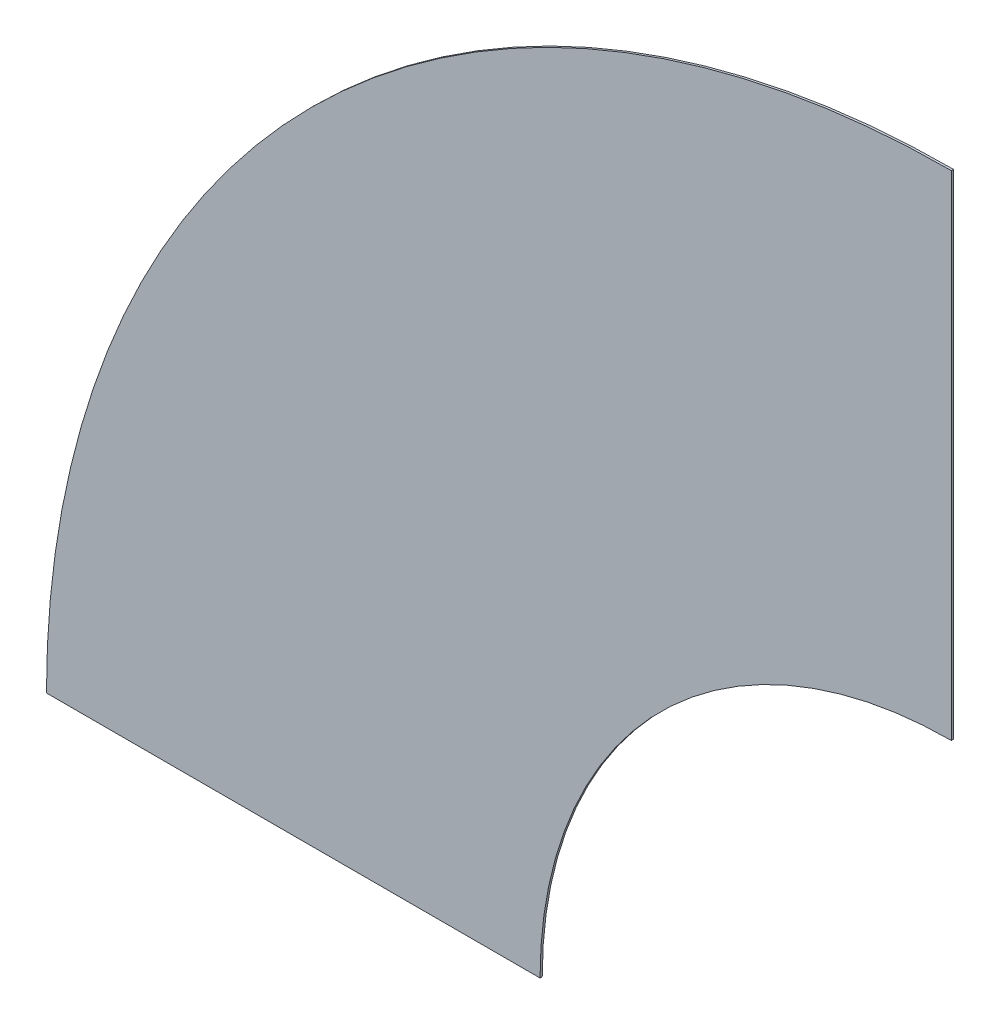
ISO-10303-21;
HEADER;
FILE_DESCRIPTION(('STEP AP214'),'2;1');
FILE_NAME('part.step','',(''),(''),'','','');
FILE_SCHEMA(('AUTOMOTIVE_DESIGN { 1 0 10303 214 1 1 1 1 }'));
ENDSEC;
DATA;
#1=APPLICATION_CONTEXT('core data for automotive mechanical design processes');
#2=APPLICATION_PROTOCOL_DEFINITION('international standard','automotive_design',2000,#1);
#3=PRODUCT_CONTEXT('',#1,'mechanical');
#4=PRODUCT('Part','Part','',(#3));
#5=PRODUCT_RELATED_PRODUCT_CATEGORY('part','',(#4));
#6=PRODUCT_DEFINITION_FORMATION('','',#4);
#7=PRODUCT_DEFINITION_CONTEXT('part definition',#1,'design');
#8=PRODUCT_DEFINITION('design','',#6,#7);
#9=PRODUCT_DEFINITION_SHAPE('','',#8);
#10=(LENGTH_UNIT() NAMED_UNIT(*) SI_UNIT(.MILLI.,.METRE.));
#11=(NAMED_UNIT(*) PLANE_ANGLE_UNIT() SI_UNIT($,.RADIAN.));
#12=(NAMED_UNIT(*) SI_UNIT($,.STERADIAN.) SOLID_ANGLE_UNIT());
#13=UNCERTAINTY_MEASURE_WITH_UNIT(LENGTH_MEASURE(1.E-05),#10,'distance_accuracy_value','');
#14=(GEOMETRIC_REPRESENTATION_CONTEXT(3) GLOBAL_UNCERTAINTY_ASSIGNED_CONTEXT((#13)) GLOBAL_UNIT_ASSIGNED_CONTEXT((#10,
#11,#12)) REPRESENTATION_CONTEXT('',''));
#15=CARTESIAN_POINT('',(0.,0.,0.));
#16=DIRECTION('',(0.,0.,1.));
#17=DIRECTION('',(1.,0.,0.));
#18=AXIS2_PLACEMENT_3D('',#15,#16,#17);
#19=CARTESIAN_POINT('',(0.,0.,0.));
#20=DIRECTION('',(-1.,0.,0.));
#21=DIRECTION('',(0.,-1.,0.));
#22=AXIS2_PLACEMENT_3D('',#19,#20,#21);
#23=PLANE('',#22);
#24=DIRECTION('',(0.,1.,0.));
#25=VECTOR('',#24,1.);
#26=CARTESIAN_POINT('',(0.,825.,0.999999999999931));
#27=LINE('',#26,#25);
#28=CARTESIAN_POINT('',(0.,375.,1.00000000000007));
#29=VERTEX_POINT('',#28);
#30=CARTESIAN_POINT('',(0.,825.,0.999999999999931));
#31=VERTEX_POINT('',#30);
#32=EDGE_CURVE('E76',#29,#31,#27,.T.);
#33=ORIENTED_EDGE('',*,*,#32,.F.);
#34=DIRECTION('',(0.,0.,1.));
#35=VECTOR('',#34,1.);
#36=CARTESIAN_POINT('',(0.,375.,-0.999999999999931));
#37=LINE('',#36,#35);
#38=CARTESIAN_POINT('',(0.,375.,-0.999999999999931));
#39=VERTEX_POINT('',#38);
#40=EDGE_CURVE('E80',#39,#29,#37,.T.);
#41=ORIENTED_EDGE('',*,*,#40,.F.);
#42=DIRECTION('',(0.,-1.,0.));
#43=VECTOR('',#42,1.);
#44=CARTESIAN_POINT('',(0.,825.,-1.00000000000007));
#45=LINE('',#44,#43);
#46=CARTESIAN_POINT('',(0.,825.,-1.00000000000007));
#47=VERTEX_POINT('',#46);
#48=EDGE_CURVE('E83',#47,#39,#45,.T.);
#49=ORIENTED_EDGE('',*,*,#48,.F.);
#50=DIRECTION('',(0.,0.,-1.));
#51=VECTOR('',#50,1.);
#52=CARTESIAN_POINT('',(0.,825.,-1.00000000000007));
#53=LINE('',#52,#51);
#54=EDGE_CURVE('E71',#31,#47,#53,.T.);
#55=ORIENTED_EDGE('',*,*,#54,.F.);
#56=EDGE_LOOP('',(#33,#41,#49,#55));
#57=FACE_BOUND('',#56,.T.);
#58=ADVANCED_FACE('F41',(#57),#23,.F.);
#59=CARTESIAN_POINT('',(0.,0.,0.));
#60=DIRECTION('',(0.,-1.,0.));
#61=DIRECTION('',(1.,0.,0.));
#62=AXIS2_PLACEMENT_3D('',#59,#60,#61);
#63=PLANE('',#62);
#64=DIRECTION('',(-1.,0.,0.));
#65=VECTOR('',#64,1.);
#66=CARTESIAN_POINT('',(-825.,-2.50032122992888E-12,0.999999999999931));
#67=LINE('',#66,#65);
#68=CARTESIAN_POINT('',(-375.,-1.15654932486281E-12,1.00000000000007));
#69=VERTEX_POINT('',#68);
#70=CARTESIAN_POINT('',(-825.,-2.50032122992888E-12,0.999999999999931));
#71=VERTEX_POINT('',#70);
#72=EDGE_CURVE('E54',#69,#71,#67,.T.);
#73=ORIENTED_EDGE('',*,*,#72,.T.);
#74=DIRECTION('',(0.,0.,-1.));
#75=VECTOR('',#74,1.);
#76=CARTESIAN_POINT('',(-825.,-2.50032122992888E-12,-1.00000000000007));
#77=LINE('',#76,#75);
#78=CARTESIAN_POINT('',(-825.,-2.50032122992888E-12,-1.00000000000007));
#79=VERTEX_POINT('',#78);
#80=EDGE_CURVE('E11',#71,#79,#77,.T.);
#81=ORIENTED_EDGE('',*,*,#80,.T.);
#82=DIRECTION('',(1.,0.,0.));
#83=VECTOR('',#82,1.);
#84=CARTESIAN_POINT('',(-825.,-2.50032122992888E-12,-1.00000000000007));
#85=LINE('',#84,#83);
#86=CARTESIAN_POINT('',(-375.,-1.15654932486281E-12,-0.999999999999931));
#87=VERTEX_POINT('',#86);
#88=EDGE_CURVE('E97',#79,#87,#85,.T.);
#89=ORIENTED_EDGE('',*,*,#88,.T.);
#90=DIRECTION('',(0.,0.,1.));
#91=VECTOR('',#90,1.);
#92=CARTESIAN_POINT('',(-375.,-1.15654932486281E-12,-0.999999999999931));
#93=LINE('',#92,#91);
#94=EDGE_CURVE('E60',#87,#69,#93,.T.);
#95=ORIENTED_EDGE('',*,*,#94,.T.);
#96=EDGE_LOOP('',(#73,#81,#89,#95));
#97=FACE_BOUND('',#96,.T.);
#98=ADVANCED_FACE('F122',(#97),#63,.T.);
#99=CARTESIAN_POINT('',(0.,825.,-1.));
#100=DIRECTION('',(0.,0.,-1.));
#101=DIRECTION('',(-1.,0.,0.));
#102=AXIS2_PLACEMENT_3D('',#99,#100,#101);
#103=PLANE('',#102);
#104=CARTESIAN_POINT('',(0.,0.,-0.999999999999931));
#105=DIRECTION('',(0.,0.,1.));
#106=DIRECTION('',(0.,1.,0.));
#107=AXIS2_PLACEMENT_3D('',#104,#105,#106);
#108=CIRCLE('',#107,375.);
#109=EDGE_CURVE('E99',#39,#87,#108,.T.);
#110=ORIENTED_EDGE('',*,*,#109,.T.);
#111=ORIENTED_EDGE('',*,*,#88,.F.);
#112=CARTESIAN_POINT('',(0.,0.,-1.00000000000007));
#113=DIRECTION('',(0.,0.,1.));
#114=DIRECTION('',(0.,1.,0.));
#115=AXIS2_PLACEMENT_3D('',#112,#113,#114);
#116=CIRCLE('',#115,825.);
#117=EDGE_CURVE('E93',#47,#79,#116,.T.);
#118=ORIENTED_EDGE('',*,*,#117,.F.);
#119=ORIENTED_EDGE('',*,*,#48,.T.);
#120=EDGE_LOOP('',(#110,#111,#118,#119));
#121=FACE_BOUND('',#120,.T.);
#122=ADVANCED_FACE('F96',(#121),#103,.T.);
#123=CARTESIAN_POINT('',(0.,0.,0.));
#124=DIRECTION('',(0.,0.,1.));
#125=DIRECTION('',(1.,0.,0.));
#126=AXIS2_PLACEMENT_3D('',#123,#124,#125);
#127=CYLINDRICAL_SURFACE('',#126,375.);
#128=CARTESIAN_POINT('',(0.,0.,1.00000000000007));
#129=DIRECTION('',(0.,0.,1.));
#130=DIRECTION('',(0.,1.,0.));
#131=AXIS2_PLACEMENT_3D('',#128,#129,#130);
#132=CIRCLE('',#131,375.);
#133=EDGE_CURVE('E105',#29,#69,#132,.T.);
#134=ORIENTED_EDGE('',*,*,#133,.T.);
#135=ORIENTED_EDGE('',*,*,#94,.F.);
#136=ORIENTED_EDGE('',*,*,#109,.F.);
#137=ORIENTED_EDGE('',*,*,#40,.T.);
#138=EDGE_LOOP('',(#134,#135,#136,#137));
#139=FACE_BOUND('',#138,.T.);
#140=ADVANCED_FACE('F114',(#139),#127,.F.);
#141=CARTESIAN_POINT('',(0.,825.,1.));
#142=DIRECTION('',(0.,0.,1.));
#143=DIRECTION('',(1.,0.,0.));
#144=AXIS2_PLACEMENT_3D('',#141,#142,#143);
#145=PLANE('',#144);
#146=CARTESIAN_POINT('',(0.,0.,0.999999999999931));
#147=DIRECTION('',(0.,0.,1.));
#148=DIRECTION('',(0.,1.,0.));
#149=AXIS2_PLACEMENT_3D('',#146,#147,#148);
#150=CIRCLE('',#149,825.);
#151=EDGE_CURVE('E48',#31,#71,#150,.T.);
#152=ORIENTED_EDGE('',*,*,#151,.T.);
#153=ORIENTED_EDGE('',*,*,#72,.F.);
#154=ORIENTED_EDGE('',*,*,#133,.F.);
#155=ORIENTED_EDGE('',*,*,#32,.T.);
#156=EDGE_LOOP('',(#152,#153,#154,#155));
#157=FACE_BOUND('',#156,.T.);
#158=ADVANCED_FACE('F111',(#157),#145,.T.);
#159=CARTESIAN_POINT('',(0.,0.,0.));
#160=DIRECTION('',(0.,0.,1.));
#161=DIRECTION('',(1.,0.,0.));
#162=AXIS2_PLACEMENT_3D('',#159,#160,#161);
#163=CYLINDRICAL_SURFACE('',#162,825.);
#164=ORIENTED_EDGE('',*,*,#80,.F.);
#165=ORIENTED_EDGE('',*,*,#151,.F.);
#166=ORIENTED_EDGE('',*,*,#54,.T.);
#167=ORIENTED_EDGE('',*,*,#117,.T.);
#168=EDGE_LOOP('',(#164,#165,#166,#167));
#169=FACE_BOUND('',#168,.T.);
#170=ADVANCED_FACE('F92',(#169),#163,.T.);
#171=CLOSED_SHELL('',(#58,#98,#122,#140,#158,#170));
#172=MANIFOLD_SOLID_BREP('B2',#171);
#173=ADVANCED_BREP_SHAPE_REPRESENTATION('',(#18,#172),#14);
#174=SHAPE_DEFINITION_REPRESENTATION(#9,#173);
ENDSEC;
END-ISO-10303-21;
